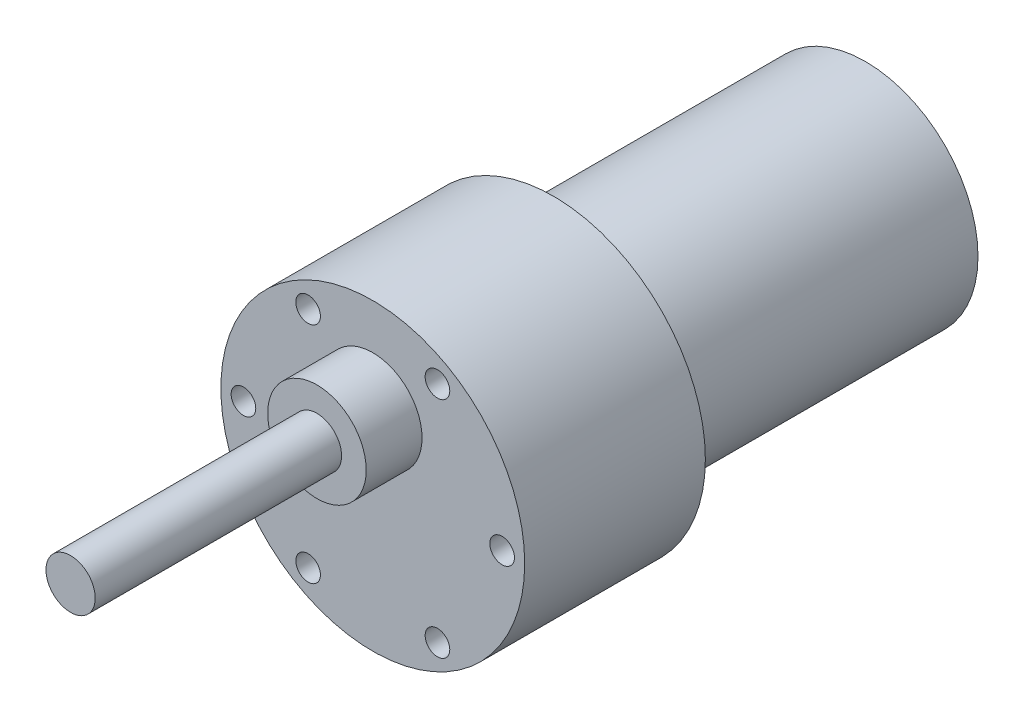
ISO-10303-21;
HEADER;
FILE_DESCRIPTION(('STEP AP214'),'2;1');
FILE_NAME('part.step','',(''),(''),'','','');
FILE_SCHEMA(('AUTOMOTIVE_DESIGN { 1 0 10303 214 1 1 1 1 }'));
ENDSEC;
DATA;
#1=APPLICATION_CONTEXT('core data for automotive mechanical design processes');
#2=APPLICATION_PROTOCOL_DEFINITION('international standard','automotive_design',2000,#1);
#3=PRODUCT_CONTEXT('',#1,'mechanical');
#4=PRODUCT('Part','Part','',(#3));
#5=PRODUCT_RELATED_PRODUCT_CATEGORY('part','',(#4));
#6=PRODUCT_DEFINITION_FORMATION('','',#4);
#7=PRODUCT_DEFINITION_CONTEXT('part definition',#1,'design');
#8=PRODUCT_DEFINITION('design','',#6,#7);
#9=PRODUCT_DEFINITION_SHAPE('','',#8);
#10=(LENGTH_UNIT() NAMED_UNIT(*) SI_UNIT(.MILLI.,.METRE.));
#11=(NAMED_UNIT(*) PLANE_ANGLE_UNIT() SI_UNIT($,.RADIAN.));
#12=(NAMED_UNIT(*) SI_UNIT($,.STERADIAN.) SOLID_ANGLE_UNIT());
#13=UNCERTAINTY_MEASURE_WITH_UNIT(LENGTH_MEASURE(1.E-05),#10,'distance_accuracy_value','');
#14=(GEOMETRIC_REPRESENTATION_CONTEXT(3) GLOBAL_UNCERTAINTY_ASSIGNED_CONTEXT((#13)) GLOBAL_UNIT_ASSIGNED_CONTEXT((#10,
#11,#12)) REPRESENTATION_CONTEXT('',''));
#15=CARTESIAN_POINT('',(0.,0.,0.));
#16=DIRECTION('',(0.,0.,1.));
#17=DIRECTION('',(1.,0.,0.));
#18=AXIS2_PLACEMENT_3D('',#15,#16,#17);
#19=CARTESIAN_POINT('',(0.,0.,38.));
#20=DIRECTION('',(0.,0.,-1.));
#21=DIRECTION('',(-1.,0.,0.));
#22=AXIS2_PLACEMENT_3D('',#19,#20,#21);
#23=CYLINDRICAL_SURFACE('',#22,13.7);
#24=CARTESIAN_POINT('',(0.,0.,38.));
#25=DIRECTION('',(0.,0.,1.));
#26=DIRECTION('',(1.,0.,0.));
#27=AXIS2_PLACEMENT_3D('',#24,#25,#26);
#28=CIRCLE('',#27,13.7);
#29=CARTESIAN_POINT('',(13.7,0.,38.));
#30=VERTEX_POINT('',#29);
#31=EDGE_CURVE('E49',#30,#30,#28,.T.);
#32=ORIENTED_EDGE('',*,*,#31,.F.);
#33=EDGE_LOOP('',(#32));
#34=FACE_BOUND('',#33,.T.);
#35=CARTESIAN_POINT('',(0.,0.,0.));
#36=DIRECTION('',(0.,0.,1.));
#37=DIRECTION('',(1.,0.,0.));
#38=AXIS2_PLACEMENT_3D('',#35,#36,#37);
#39=CIRCLE('',#38,13.7);
#40=CARTESIAN_POINT('',(13.7,0.,0.));
#41=VERTEX_POINT('',#40);
#42=EDGE_CURVE('E45',#41,#41,#39,.T.);
#43=ORIENTED_EDGE('',*,*,#42,.T.);
#44=EDGE_LOOP('',(#43));
#45=FACE_BOUND('',#44,.T.);
#46=ADVANCED_FACE('F42',(#34,#45),#23,.T.);
#47=CARTESIAN_POINT('',(0.,0.,0.));
#48=DIRECTION('',(0.,0.,1.));
#49=DIRECTION('',(1.,0.,0.));
#50=AXIS2_PLACEMENT_3D('',#47,#48,#49);
#51=PLANE('',#50);
#52=ORIENTED_EDGE('',*,*,#42,.F.);
#53=EDGE_LOOP('',(#52));
#54=FACE_BOUND('',#53,.T.);
#55=ADVANCED_FACE('F90',(#54),#51,.F.);
#56=CARTESIAN_POINT('',(0.,0.,60.));
#57=DIRECTION('',(0.,0.,-1.));
#58=DIRECTION('',(-1.,0.,0.));
#59=AXIS2_PLACEMENT_3D('',#56,#57,#58);
#60=CYLINDRICAL_SURFACE('',#59,18.5);
#61=CARTESIAN_POINT('',(0.,0.,60.));
#62=DIRECTION('',(0.,0.,1.));
#63=DIRECTION('',(1.,0.,0.));
#64=AXIS2_PLACEMENT_3D('',#61,#62,#63);
#65=CIRCLE('',#64,18.5);
#66=CARTESIAN_POINT('',(18.5,0.,60.));
#67=VERTEX_POINT('',#66);
#68=EDGE_CURVE('E65',#67,#67,#65,.T.);
#69=ORIENTED_EDGE('',*,*,#68,.F.);
#70=EDGE_LOOP('',(#69));
#71=FACE_BOUND('',#70,.T.);
#72=CARTESIAN_POINT('',(0.,0.,38.));
#73=DIRECTION('',(0.,0.,1.));
#74=DIRECTION('',(1.,0.,0.));
#75=AXIS2_PLACEMENT_3D('',#72,#73,#74);
#76=CIRCLE('',#75,18.5);
#77=CARTESIAN_POINT('',(18.5,0.,38.));
#78=VERTEX_POINT('',#77);
#79=EDGE_CURVE('E61',#78,#78,#76,.T.);
#80=ORIENTED_EDGE('',*,*,#79,.T.);
#81=EDGE_LOOP('',(#80));
#82=FACE_BOUND('',#81,.T.);
#83=ADVANCED_FACE('F71',(#71,#82),#60,.T.);
#84=CARTESIAN_POINT('',(0.,0.,60.));
#85=DIRECTION('',(0.,0.,1.));
#86=DIRECTION('',(1.,0.,0.));
#87=AXIS2_PLACEMENT_3D('',#84,#85,#86);
#88=PLANE('',#87);
#89=CARTESIAN_POINT('',(-15.75,0.,60.));
#90=DIRECTION('',(0.,0.,1.));
#91=DIRECTION('',(1.,0.,0.));
#92=AXIS2_PLACEMENT_3D('',#89,#90,#91);
#93=CIRCLE('',#92,1.5);
#94=CARTESIAN_POINT('',(-14.25,0.,60.));
#95=VERTEX_POINT('',#94);
#96=EDGE_CURVE('E284',#95,#95,#93,.T.);
#97=ORIENTED_EDGE('',*,*,#96,.F.);
#98=EDGE_LOOP('',(#97));
#99=FACE_BOUND('',#98,.T.);
#100=CARTESIAN_POINT('',(-7.87500000000016,-13.6399001096048,60.));
#101=DIRECTION('',(0.,0.,1.));
#102=DIRECTION('',(1.,0.,0.));
#103=AXIS2_PLACEMENT_3D('',#100,#101,#102);
#104=CIRCLE('',#103,1.5);
#105=CARTESIAN_POINT('',(-6.37500000000016,-13.6399001096048,60.));
#106=VERTEX_POINT('',#105);
#107=EDGE_CURVE('E295',#106,#106,#104,.T.);
#108=ORIENTED_EDGE('',*,*,#107,.F.);
#109=EDGE_LOOP('',(#108));
#110=FACE_BOUND('',#109,.T.);
#111=CARTESIAN_POINT('',(7.87499999999987,-13.639900109605,60.));
#112=DIRECTION('',(0.,0.,1.));
#113=DIRECTION('',(1.,0.,0.));
#114=AXIS2_PLACEMENT_3D('',#111,#112,#113);
#115=CIRCLE('',#114,1.5);
#116=CARTESIAN_POINT('',(9.37499999999987,-13.639900109605,60.));
#117=VERTEX_POINT('',#116);
#118=EDGE_CURVE('E294',#117,#117,#115,.T.);
#119=ORIENTED_EDGE('',*,*,#118,.F.);
#120=EDGE_LOOP('',(#119));
#121=FACE_BOUND('',#120,.T.);
#122=CARTESIAN_POINT('',(15.75,-1.09981662173559E-13,60.));
#123=DIRECTION('',(0.,0.,1.));
#124=DIRECTION('',(1.,0.,0.));
#125=AXIS2_PLACEMENT_3D('',#122,#123,#124);
#126=CIRCLE('',#125,1.5);
#127=CARTESIAN_POINT('',(17.25,-1.09981662173559E-13,60.));
#128=VERTEX_POINT('',#127);
#129=EDGE_CURVE('E312',#128,#128,#126,.T.);
#130=ORIENTED_EDGE('',*,*,#129,.F.);
#131=EDGE_LOOP('',(#130));
#132=FACE_BOUND('',#131,.T.);
#133=CARTESIAN_POINT('',(7.87500000000006,13.6399001096049,60.));
#134=DIRECTION('',(0.,0.,1.));
#135=DIRECTION('',(1.,0.,0.));
#136=AXIS2_PLACEMENT_3D('',#133,#134,#135);
#137=CIRCLE('',#136,1.5);
#138=CARTESIAN_POINT('',(9.37500000000007,13.6399001096049,60.));
#139=VERTEX_POINT('',#138);
#140=EDGE_CURVE('E306',#139,#139,#137,.T.);
#141=ORIENTED_EDGE('',*,*,#140,.F.);
#142=EDGE_LOOP('',(#141));
#143=FACE_BOUND('',#142,.T.);
#144=CARTESIAN_POINT('',(-7.87499999999997,13.6399001096049,60.));
#145=DIRECTION('',(0.,0.,1.));
#146=DIRECTION('',(1.,0.,0.));
#147=AXIS2_PLACEMENT_3D('',#144,#145,#146);
#148=CIRCLE('',#147,1.5);
#149=CARTESIAN_POINT('',(-6.37499999999997,13.6399001096049,60.));
#150=VERTEX_POINT('',#149);
#151=EDGE_CURVE('E300',#150,#150,#148,.T.);
#152=ORIENTED_EDGE('',*,*,#151,.F.);
#153=EDGE_LOOP('',(#152));
#154=FACE_BOUND('',#153,.T.);
#155=CARTESIAN_POINT('',(0.,7.,60.));
#156=DIRECTION('',(0.,0.,1.));
#157=DIRECTION('',(1.,0.,0.));
#158=AXIS2_PLACEMENT_3D('',#155,#156,#157);
#159=CIRCLE('',#158,6.);
#160=CARTESIAN_POINT('',(6.,7.,60.));
#161=VERTEX_POINT('',#160);
#162=EDGE_CURVE('E62',#161,#161,#159,.T.);
#163=ORIENTED_EDGE('',*,*,#162,.F.);
#164=EDGE_LOOP('',(#163));
#165=FACE_BOUND('',#164,.T.);
#166=ORIENTED_EDGE('',*,*,#68,.T.);
#167=EDGE_LOOP('',(#166));
#168=FACE_BOUND('',#167,.T.);
#169=ADVANCED_FACE('F76',(#99,#110,#121,#132,#143,#154,#165,#168),#88,.T.);
#170=CARTESIAN_POINT('',(0.,0.,38.));
#171=DIRECTION('',(0.,0.,1.));
#172=DIRECTION('',(1.,0.,0.));
#173=AXIS2_PLACEMENT_3D('',#170,#171,#172);
#174=PLANE('',#173);
#175=ORIENTED_EDGE('',*,*,#31,.T.);
#176=EDGE_LOOP('',(#175));
#177=FACE_BOUND('',#176,.T.);
#178=ORIENTED_EDGE('',*,*,#79,.F.);
#179=EDGE_LOOP('',(#178));
#180=FACE_BOUND('',#179,.T.);
#181=ADVANCED_FACE('F73',(#177,#180),#174,.F.);
#182=CARTESIAN_POINT('',(0.,7.,66.8));
#183=DIRECTION('',(0.,0.,-1.));
#184=DIRECTION('',(-1.,0.,0.));
#185=AXIS2_PLACEMENT_3D('',#182,#183,#184);
#186=CYLINDRICAL_SURFACE('',#185,6.);
#187=CARTESIAN_POINT('',(0.,7.,66.8));
#188=DIRECTION('',(0.,0.,1.));
#189=DIRECTION('',(1.,0.,0.));
#190=AXIS2_PLACEMENT_3D('',#187,#188,#189);
#191=CIRCLE('',#190,6.);
#192=CARTESIAN_POINT('',(6.,7.,66.8));
#193=VERTEX_POINT('',#192);
#194=EDGE_CURVE('E58',#193,#193,#191,.T.);
#195=ORIENTED_EDGE('',*,*,#194,.F.);
#196=EDGE_LOOP('',(#195));
#197=FACE_BOUND('',#196,.T.);
#198=ORIENTED_EDGE('',*,*,#162,.T.);
#199=EDGE_LOOP('',(#198));
#200=FACE_BOUND('',#199,.T.);
#201=ADVANCED_FACE('F75',(#197,#200),#186,.T.);
#202=CARTESIAN_POINT('',(0.,7.,66.8));
#203=DIRECTION('',(0.,0.,1.));
#204=DIRECTION('',(1.,0.,0.));
#205=AXIS2_PLACEMENT_3D('',#202,#203,#204);
#206=PLANE('',#205);
#207=CARTESIAN_POINT('',(0.,7.,66.8));
#208=DIRECTION('',(0.,0.,1.));
#209=DIRECTION('',(1.,0.,0.));
#210=AXIS2_PLACEMENT_3D('',#207,#208,#209);
#211=CIRCLE('',#210,3.);
#212=CARTESIAN_POINT('',(3.,7.,66.8));
#213=VERTEX_POINT('',#212);
#214=EDGE_CURVE('E12',#213,#213,#211,.T.);
#215=ORIENTED_EDGE('',*,*,#214,.F.);
#216=EDGE_LOOP('',(#215));
#217=FACE_BOUND('',#216,.T.);
#218=ORIENTED_EDGE('',*,*,#194,.T.);
#219=EDGE_LOOP('',(#218));
#220=FACE_BOUND('',#219,.T.);
#221=ADVANCED_FACE('F83',(#217,#220),#206,.T.);
#222=CARTESIAN_POINT('',(0.,7.,96.8));
#223=DIRECTION('',(0.,0.,-1.));
#224=DIRECTION('',(-1.,0.,0.));
#225=AXIS2_PLACEMENT_3D('',#222,#223,#224);
#226=CYLINDRICAL_SURFACE('',#225,3.);
#227=CARTESIAN_POINT('',(0.,7.,96.8));
#228=DIRECTION('',(0.,0.,1.));
#229=DIRECTION('',(1.,0.,0.));
#230=AXIS2_PLACEMENT_3D('',#227,#228,#229);
#231=CIRCLE('',#230,3.);
#232=CARTESIAN_POINT('',(3.,7.,96.8));
#233=VERTEX_POINT('',#232);
#234=EDGE_CURVE('E56',#233,#233,#231,.T.);
#235=ORIENTED_EDGE('',*,*,#234,.F.);
#236=EDGE_LOOP('',(#235));
#237=FACE_BOUND('',#236,.T.);
#238=ORIENTED_EDGE('',*,*,#214,.T.);
#239=EDGE_LOOP('',(#238));
#240=FACE_BOUND('',#239,.T.);
#241=ADVANCED_FACE('F246',(#237,#240),#226,.T.);
#242=CARTESIAN_POINT('',(0.,7.,96.8));
#243=DIRECTION('',(0.,0.,1.));
#244=DIRECTION('',(1.,0.,0.));
#245=AXIS2_PLACEMENT_3D('',#242,#243,#244);
#246=PLANE('',#245);
#247=ORIENTED_EDGE('',*,*,#234,.T.);
#248=EDGE_LOOP('',(#247));
#249=FACE_BOUND('',#248,.T.);
#250=ADVANCED_FACE('F119',(#249),#246,.T.);
#251=CARTESIAN_POINT('',(-7.87499999999997,13.6399001096049,55.));
#252=DIRECTION('',(0.,0.,1.));
#253=DIRECTION('',(1.,0.,0.));
#254=AXIS2_PLACEMENT_3D('',#251,#252,#253);
#255=CYLINDRICAL_SURFACE('',#254,1.5);
#256=CARTESIAN_POINT('',(-7.87499999999997,13.6399001096049,55.));
#257=DIRECTION('',(0.,0.,1.));
#258=DIRECTION('',(1.,0.,0.));
#259=AXIS2_PLACEMENT_3D('',#256,#257,#258);
#260=CIRCLE('',#259,1.5);
#261=CARTESIAN_POINT('',(-6.37499999999997,13.6399001096049,55.));
#262=VERTEX_POINT('',#261);
#263=EDGE_CURVE('E288',#262,#262,#260,.T.);
#264=ORIENTED_EDGE('',*,*,#263,.F.);
#265=EDGE_LOOP('',(#264));
#266=FACE_BOUND('',#265,.T.);
#267=ORIENTED_EDGE('',*,*,#151,.T.);
#268=EDGE_LOOP('',(#267));
#269=FACE_BOUND('',#268,.T.);
#270=ADVANCED_FACE('F124',(#266,#269),#255,.F.);
#271=CARTESIAN_POINT('',(-7.87499999999997,13.6399001096049,55.));
#272=DIRECTION('',(0.,0.,1.));
#273=DIRECTION('',(1.,0.,0.));
#274=AXIS2_PLACEMENT_3D('',#271,#272,#273);
#275=PLANE('',#274);
#276=ORIENTED_EDGE('',*,*,#263,.T.);
#277=EDGE_LOOP('',(#276));
#278=FACE_BOUND('',#277,.T.);
#279=ADVANCED_FACE('F129',(#278),#275,.T.);
#280=CARTESIAN_POINT('',(7.87500000000006,13.6399001096049,55.));
#281=DIRECTION('',(0.,0.,1.));
#282=DIRECTION('',(1.,0.,0.));
#283=AXIS2_PLACEMENT_3D('',#280,#281,#282);
#284=CYLINDRICAL_SURFACE('',#283,1.5);
#285=CARTESIAN_POINT('',(7.87500000000006,13.6399001096049,55.));
#286=DIRECTION('',(0.,0.,1.));
#287=DIRECTION('',(1.,0.,0.));
#288=AXIS2_PLACEMENT_3D('',#285,#286,#287);
#289=CIRCLE('',#288,1.5);
#290=CARTESIAN_POINT('',(9.37500000000007,13.6399001096049,55.));
#291=VERTEX_POINT('',#290);
#292=EDGE_CURVE('E303',#291,#291,#289,.T.);
#293=ORIENTED_EDGE('',*,*,#292,.F.);
#294=EDGE_LOOP('',(#293));
#295=FACE_BOUND('',#294,.T.);
#296=ORIENTED_EDGE('',*,*,#140,.T.);
#297=EDGE_LOOP('',(#296));
#298=FACE_BOUND('',#297,.T.);
#299=ADVANCED_FACE('F139',(#295,#298),#284,.F.);
#300=CARTESIAN_POINT('',(7.87500000000006,13.6399001096049,55.));
#301=DIRECTION('',(0.,0.,1.));
#302=DIRECTION('',(1.,0.,0.));
#303=AXIS2_PLACEMENT_3D('',#300,#301,#302);
#304=PLANE('',#303);
#305=ORIENTED_EDGE('',*,*,#292,.T.);
#306=EDGE_LOOP('',(#305));
#307=FACE_BOUND('',#306,.T.);
#308=ADVANCED_FACE('F149',(#307),#304,.T.);
#309=CARTESIAN_POINT('',(15.75,-1.09981662173559E-13,55.));
#310=DIRECTION('',(0.,0.,1.));
#311=DIRECTION('',(1.,0.,0.));
#312=AXIS2_PLACEMENT_3D('',#309,#310,#311);
#313=CYLINDRICAL_SURFACE('',#312,1.5);
#314=CARTESIAN_POINT('',(15.75,-1.09981662173559E-13,55.));
#315=DIRECTION('',(0.,0.,1.));
#316=DIRECTION('',(1.,0.,0.));
#317=AXIS2_PLACEMENT_3D('',#314,#315,#316);
#318=CIRCLE('',#317,1.5);
#319=CARTESIAN_POINT('',(17.25,-1.09981662173559E-13,55.));
#320=VERTEX_POINT('',#319);
#321=EDGE_CURVE('E309',#320,#320,#318,.T.);
#322=ORIENTED_EDGE('',*,*,#321,.F.);
#323=EDGE_LOOP('',(#322));
#324=FACE_BOUND('',#323,.T.);
#325=ORIENTED_EDGE('',*,*,#129,.T.);
#326=EDGE_LOOP('',(#325));
#327=FACE_BOUND('',#326,.T.);
#328=ADVANCED_FACE('F159',(#324,#327),#313,.F.);
#329=CARTESIAN_POINT('',(15.75,-1.09981662173559E-13,55.));
#330=DIRECTION('',(0.,0.,1.));
#331=DIRECTION('',(1.,0.,0.));
#332=AXIS2_PLACEMENT_3D('',#329,#330,#331);
#333=PLANE('',#332);
#334=ORIENTED_EDGE('',*,*,#321,.T.);
#335=EDGE_LOOP('',(#334));
#336=FACE_BOUND('',#335,.T.);
#337=ADVANCED_FACE('F169',(#336),#333,.T.);
#338=CARTESIAN_POINT('',(7.87499999999987,-13.639900109605,55.));
#339=DIRECTION('',(0.,0.,1.));
#340=DIRECTION('',(1.,0.,0.));
#341=AXIS2_PLACEMENT_3D('',#338,#339,#340);
#342=CYLINDRICAL_SURFACE('',#341,1.5);
#343=CARTESIAN_POINT('',(7.87499999999987,-13.639900109605,55.));
#344=DIRECTION('',(0.,0.,1.));
#345=DIRECTION('',(1.,0.,0.));
#346=AXIS2_PLACEMENT_3D('',#343,#344,#345);
#347=CIRCLE('',#346,1.5);
#348=CARTESIAN_POINT('',(9.37499999999987,-13.639900109605,55.));
#349=VERTEX_POINT('',#348);
#350=EDGE_CURVE('E315',#349,#349,#347,.T.);
#351=ORIENTED_EDGE('',*,*,#350,.F.);
#352=EDGE_LOOP('',(#351));
#353=FACE_BOUND('',#352,.T.);
#354=ORIENTED_EDGE('',*,*,#118,.T.);
#355=EDGE_LOOP('',(#354));
#356=FACE_BOUND('',#355,.T.);
#357=ADVANCED_FACE('F179',(#353,#356),#342,.F.);
#358=CARTESIAN_POINT('',(7.87499999999987,-13.639900109605,55.));
#359=DIRECTION('',(0.,0.,1.));
#360=DIRECTION('',(1.,0.,0.));
#361=AXIS2_PLACEMENT_3D('',#358,#359,#360);
#362=PLANE('',#361);
#363=ORIENTED_EDGE('',*,*,#350,.T.);
#364=EDGE_LOOP('',(#363));
#365=FACE_BOUND('',#364,.T.);
#366=ADVANCED_FACE('F189',(#365),#362,.T.);
#367=CARTESIAN_POINT('',(-7.87500000000016,-13.6399001096048,55.));
#368=DIRECTION('',(0.,0.,1.));
#369=DIRECTION('',(1.,0.,0.));
#370=AXIS2_PLACEMENT_3D('',#367,#368,#369);
#371=CYLINDRICAL_SURFACE('',#370,1.5);
#372=CARTESIAN_POINT('',(-7.87500000000016,-13.6399001096048,55.));
#373=DIRECTION('',(0.,0.,1.));
#374=DIRECTION('',(1.,0.,0.));
#375=AXIS2_PLACEMENT_3D('',#372,#373,#374);
#376=CIRCLE('',#375,1.5);
#377=CARTESIAN_POINT('',(-6.37500000000016,-13.6399001096048,55.));
#378=VERTEX_POINT('',#377);
#379=EDGE_CURVE('E291',#378,#378,#376,.T.);
#380=ORIENTED_EDGE('',*,*,#379,.F.);
#381=EDGE_LOOP('',(#380));
#382=FACE_BOUND('',#381,.T.);
#383=ORIENTED_EDGE('',*,*,#107,.T.);
#384=EDGE_LOOP('',(#383));
#385=FACE_BOUND('',#384,.T.);
#386=ADVANCED_FACE('F199',(#382,#385),#371,.F.);
#387=CARTESIAN_POINT('',(-7.87500000000016,-13.6399001096048,55.));
#388=DIRECTION('',(0.,0.,1.));
#389=DIRECTION('',(1.,0.,0.));
#390=AXIS2_PLACEMENT_3D('',#387,#388,#389);
#391=PLANE('',#390);
#392=ORIENTED_EDGE('',*,*,#379,.T.);
#393=EDGE_LOOP('',(#392));
#394=FACE_BOUND('',#393,.T.);
#395=ADVANCED_FACE('F209',(#394),#391,.T.);
#396=CARTESIAN_POINT('',(-15.75,0.,55.));
#397=DIRECTION('',(0.,0.,1.));
#398=DIRECTION('',(1.,0.,0.));
#399=AXIS2_PLACEMENT_3D('',#396,#397,#398);
#400=CYLINDRICAL_SURFACE('',#399,1.5);
#401=CARTESIAN_POINT('',(-15.75,0.,55.));
#402=DIRECTION('',(0.,0.,1.));
#403=DIRECTION('',(1.,0.,0.));
#404=AXIS2_PLACEMENT_3D('',#401,#402,#403);
#405=CIRCLE('',#404,1.5);
#406=CARTESIAN_POINT('',(-14.25,0.,55.));
#407=VERTEX_POINT('',#406);
#408=EDGE_CURVE('E283',#407,#407,#405,.T.);
#409=ORIENTED_EDGE('',*,*,#408,.F.);
#410=EDGE_LOOP('',(#409));
#411=FACE_BOUND('',#410,.T.);
#412=ORIENTED_EDGE('',*,*,#96,.T.);
#413=EDGE_LOOP('',(#412));
#414=FACE_BOUND('',#413,.T.);
#415=ADVANCED_FACE('F219',(#411,#414),#400,.F.);
#416=CARTESIAN_POINT('',(-15.75,0.,55.));
#417=DIRECTION('',(0.,0.,1.));
#418=DIRECTION('',(1.,0.,0.));
#419=AXIS2_PLACEMENT_3D('',#416,#417,#418);
#420=PLANE('',#419);
#421=ORIENTED_EDGE('',*,*,#408,.T.);
#422=EDGE_LOOP('',(#421));
#423=FACE_BOUND('',#422,.T.);
#424=ADVANCED_FACE('F229',(#423),#420,.T.);
#425=CLOSED_SHELL('',(#46,#55,#83,#169,#181,#201,#221,#241,#250,#270,#279,#299,#308,#328,#337,
#357,#366,#386,#395,#415,#424));
#426=MANIFOLD_SOLID_BREP('B2',#425);
#427=ADVANCED_BREP_SHAPE_REPRESENTATION('',(#18,#426),#14);
#428=SHAPE_DEFINITION_REPRESENTATION(#9,#427);
ENDSEC;
END-ISO-10303-21;
